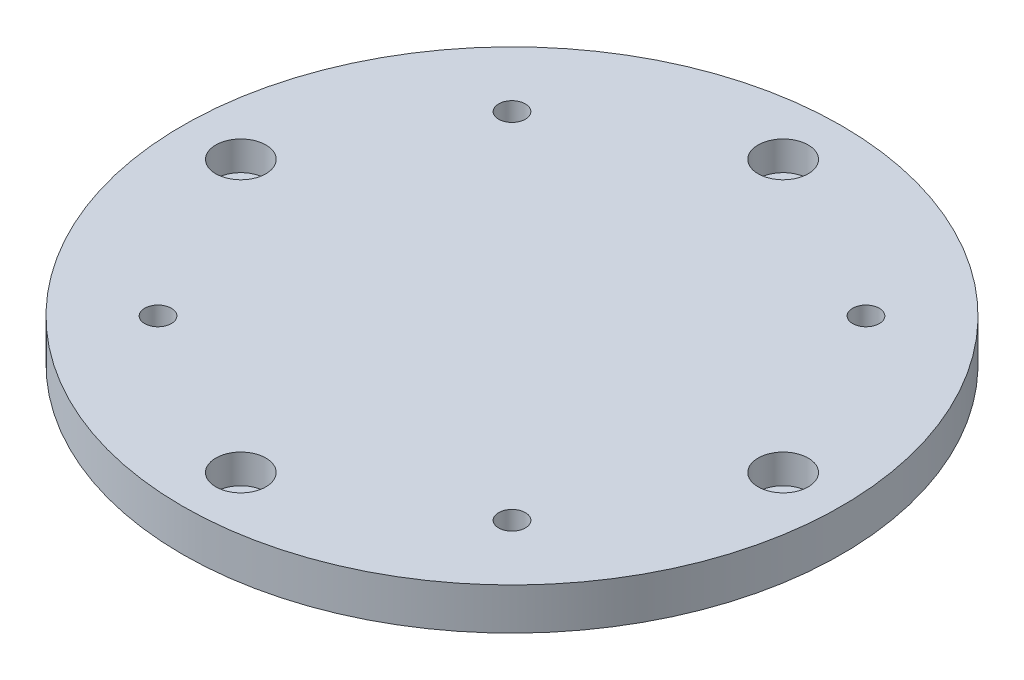
ISO-10303-21;
HEADER;
FILE_DESCRIPTION(('STEP AP214'),'2;1');
FILE_NAME('part.step','',(''),(''),'','','');
FILE_SCHEMA(('AUTOMOTIVE_DESIGN { 1 0 10303 214 1 1 1 1 }'));
ENDSEC;
DATA;
#1=APPLICATION_CONTEXT('core data for automotive mechanical design processes');
#2=APPLICATION_PROTOCOL_DEFINITION('international standard','automotive_design',2000,#1);
#3=PRODUCT_CONTEXT('',#1,'mechanical');
#4=PRODUCT('Part','Part','',(#3));
#5=PRODUCT_RELATED_PRODUCT_CATEGORY('part','',(#4));
#6=PRODUCT_DEFINITION_FORMATION('','',#4);
#7=PRODUCT_DEFINITION_CONTEXT('part definition',#1,'design');
#8=PRODUCT_DEFINITION('design','',#6,#7);
#9=PRODUCT_DEFINITION_SHAPE('','',#8);
#10=(LENGTH_UNIT() NAMED_UNIT(*) SI_UNIT(.MILLI.,.METRE.));
#11=(NAMED_UNIT(*) PLANE_ANGLE_UNIT() SI_UNIT($,.RADIAN.));
#12=(NAMED_UNIT(*) SI_UNIT($,.STERADIAN.) SOLID_ANGLE_UNIT());
#13=UNCERTAINTY_MEASURE_WITH_UNIT(LENGTH_MEASURE(1.E-05),#10,'distance_accuracy_value','');
#14=(GEOMETRIC_REPRESENTATION_CONTEXT(3) GLOBAL_UNCERTAINTY_ASSIGNED_CONTEXT((#13)) GLOBAL_UNIT_ASSIGNED_CONTEXT((#10,
#11,#12)) REPRESENTATION_CONTEXT('',''));
#15=CARTESIAN_POINT('',(0.,0.,0.));
#16=DIRECTION('',(0.,0.,1.));
#17=DIRECTION('',(1.,0.,0.));
#18=AXIS2_PLACEMENT_3D('',#15,#16,#17);
#19=CARTESIAN_POINT('',(-32.5,0.,0.));
#20=DIRECTION('',(0.,1.,0.));
#21=DIRECTION('',(0.,0.,1.));
#22=AXIS2_PLACEMENT_3D('',#19,#20,#21);
#23=CYLINDRICAL_SURFACE('',#22,1.5);
#24=CARTESIAN_POINT('',(-32.5,0.,0.));
#25=DIRECTION('',(0.,1.,0.));
#26=DIRECTION('',(0.,0.,1.));
#27=AXIS2_PLACEMENT_3D('',#24,#25,#26);
#28=CIRCLE('',#27,1.5);
#29=CARTESIAN_POINT('',(-32.5,0.,1.5));
#30=VERTEX_POINT('',#29);
#31=EDGE_CURVE('E59',#30,#30,#28,.T.);
#32=ORIENTED_EDGE('',*,*,#31,.F.);
#33=EDGE_LOOP('',(#32));
#34=FACE_BOUND('',#33,.T.);
#35=CARTESIAN_POINT('',(-32.5,1.5,0.));
#36=DIRECTION('',(0.,1.,0.));
#37=DIRECTION('',(0.,0.,1.));
#38=AXIS2_PLACEMENT_3D('',#35,#36,#37);
#39=CIRCLE('',#38,1.5);
#40=CARTESIAN_POINT('',(-32.5,1.5,1.5));
#41=VERTEX_POINT('',#40);
#42=EDGE_CURVE('E44',#41,#41,#39,.F.);
#43=ORIENTED_EDGE('',*,*,#42,.F.);
#44=EDGE_LOOP('',(#43));
#45=FACE_BOUND('',#44,.T.);
#46=ADVANCED_FACE('F40',(#34,#45),#23,.F.);
#47=CARTESIAN_POINT('',(0.,0.,32.5));
#48=DIRECTION('',(0.,1.,0.));
#49=DIRECTION('',(0.,0.,1.));
#50=AXIS2_PLACEMENT_3D('',#47,#48,#49);
#51=CYLINDRICAL_SURFACE('',#50,1.5);
#52=CARTESIAN_POINT('',(0.,0.,32.5));
#53=DIRECTION('',(0.,1.,0.));
#54=DIRECTION('',(0.,0.,1.));
#55=AXIS2_PLACEMENT_3D('',#52,#53,#54);
#56=CIRCLE('',#55,1.5);
#57=CARTESIAN_POINT('',(0.,0.,34.));
#58=VERTEX_POINT('',#57);
#59=EDGE_CURVE('E83',#58,#58,#56,.T.);
#60=ORIENTED_EDGE('',*,*,#59,.F.);
#61=EDGE_LOOP('',(#60));
#62=FACE_BOUND('',#61,.T.);
#63=CARTESIAN_POINT('',(0.,1.5,32.5));
#64=DIRECTION('',(0.,1.,0.));
#65=DIRECTION('',(0.,0.,1.));
#66=AXIS2_PLACEMENT_3D('',#63,#64,#65);
#67=CIRCLE('',#66,1.5);
#68=CARTESIAN_POINT('',(0.,1.5,34.));
#69=VERTEX_POINT('',#68);
#70=EDGE_CURVE('E70',#69,#69,#67,.F.);
#71=ORIENTED_EDGE('',*,*,#70,.F.);
#72=EDGE_LOOP('',(#71));
#73=FACE_BOUND('',#72,.T.);
#74=ADVANCED_FACE('F195',(#62,#73),#51,.F.);
#75=CARTESIAN_POINT('',(32.5,0.,0.));
#76=DIRECTION('',(0.,1.,0.));
#77=DIRECTION('',(0.,0.,1.));
#78=AXIS2_PLACEMENT_3D('',#75,#76,#77);
#79=CYLINDRICAL_SURFACE('',#78,1.5);
#80=CARTESIAN_POINT('',(32.5,0.,0.));
#81=DIRECTION('',(0.,1.,0.));
#82=DIRECTION('',(0.,0.,1.));
#83=AXIS2_PLACEMENT_3D('',#80,#81,#82);
#84=CIRCLE('',#83,1.5);
#85=CARTESIAN_POINT('',(32.5,0.,1.5));
#86=VERTEX_POINT('',#85);
#87=EDGE_CURVE('E89',#86,#86,#84,.T.);
#88=ORIENTED_EDGE('',*,*,#87,.F.);
#89=EDGE_LOOP('',(#88));
#90=FACE_BOUND('',#89,.T.);
#91=CARTESIAN_POINT('',(32.5,1.5,0.));
#92=DIRECTION('',(0.,1.,0.));
#93=DIRECTION('',(0.,0.,1.));
#94=AXIS2_PLACEMENT_3D('',#91,#92,#93);
#95=CIRCLE('',#94,1.5);
#96=CARTESIAN_POINT('',(32.5,1.5,1.5));
#97=VERTEX_POINT('',#96);
#98=EDGE_CURVE('E66',#97,#97,#95,.F.);
#99=ORIENTED_EDGE('',*,*,#98,.F.);
#100=EDGE_LOOP('',(#99));
#101=FACE_BOUND('',#100,.T.);
#102=ADVANCED_FACE('F191',(#90,#101),#79,.F.);
#103=CARTESIAN_POINT('',(0.,0.,-32.5));
#104=DIRECTION('',(0.,1.,0.));
#105=DIRECTION('',(0.,0.,1.));
#106=AXIS2_PLACEMENT_3D('',#103,#104,#105);
#107=CYLINDRICAL_SURFACE('',#106,1.5);
#108=CARTESIAN_POINT('',(0.,0.,-32.5));
#109=DIRECTION('',(0.,1.,0.));
#110=DIRECTION('',(0.,0.,1.));
#111=AXIS2_PLACEMENT_3D('',#108,#109,#110);
#112=CIRCLE('',#111,1.5);
#113=CARTESIAN_POINT('',(0.,0.,-31.));
#114=VERTEX_POINT('',#113);
#115=EDGE_CURVE('E56',#114,#114,#112,.T.);
#116=ORIENTED_EDGE('',*,*,#115,.F.);
#117=EDGE_LOOP('',(#116));
#118=FACE_BOUND('',#117,.T.);
#119=CARTESIAN_POINT('',(0.,1.5,-32.5));
#120=DIRECTION('',(0.,1.,0.));
#121=DIRECTION('',(0.,0.,1.));
#122=AXIS2_PLACEMENT_3D('',#119,#120,#121);
#123=CIRCLE('',#122,1.5);
#124=CARTESIAN_POINT('',(0.,1.5,-31.));
#125=VERTEX_POINT('',#124);
#126=EDGE_CURVE('E62',#125,#125,#123,.F.);
#127=ORIENTED_EDGE('',*,*,#126,.F.);
#128=EDGE_LOOP('',(#127));
#129=FACE_BOUND('',#128,.T.);
#130=ADVANCED_FACE('F182',(#118,#129),#107,.F.);
#131=CARTESIAN_POINT('',(0.,5.,0.));
#132=DIRECTION('',(0.,-1.,0.));
#133=DIRECTION('',(0.,0.,-1.));
#134=AXIS2_PLACEMENT_3D('',#131,#132,#133);
#135=CYLINDRICAL_SURFACE('',#134,39.5);
#136=CARTESIAN_POINT('',(0.,5.,0.));
#137=DIRECTION('',(0.,1.,0.));
#138=DIRECTION('',(0.,0.,1.));
#139=AXIS2_PLACEMENT_3D('',#136,#137,#138);
#140=CIRCLE('',#139,39.5);
#141=CARTESIAN_POINT('',(0.,5.,39.5));
#142=VERTEX_POINT('',#141);
#143=EDGE_CURVE('E10',#142,#142,#140,.T.);
#144=ORIENTED_EDGE('',*,*,#143,.F.);
#145=EDGE_LOOP('',(#144));
#146=FACE_BOUND('',#145,.T.);
#147=CARTESIAN_POINT('',(0.,0.,0.));
#148=DIRECTION('',(0.,1.,0.));
#149=DIRECTION('',(0.,0.,1.));
#150=AXIS2_PLACEMENT_3D('',#147,#148,#149);
#151=CIRCLE('',#150,39.5);
#152=CARTESIAN_POINT('',(0.,0.,39.5));
#153=VERTEX_POINT('',#152);
#154=EDGE_CURVE('E49',#153,#153,#151,.T.);
#155=ORIENTED_EDGE('',*,*,#154,.T.);
#156=EDGE_LOOP('',(#155));
#157=FACE_BOUND('',#156,.T.);
#158=ADVANCED_FACE('F42',(#146,#157),#135,.T.);
#159=CARTESIAN_POINT('',(0.,5.,0.));
#160=DIRECTION('',(0.,1.,0.));
#161=DIRECTION('',(0.,0.,1.));
#162=AXIS2_PLACEMENT_3D('',#159,#160,#161);
#163=PLANE('',#162);
#164=CARTESIAN_POINT('',(-21.2132034355965,5.,21.2132034355942));
#165=DIRECTION('',(0.,-1.,0.));
#166=DIRECTION('',(0.,0.,-1.));
#167=AXIS2_PLACEMENT_3D('',#164,#165,#166);
#168=CIRCLE('',#167,1.6);
#169=CARTESIAN_POINT('',(-21.2132034355965,5.,19.6132034355942));
#170=VERTEX_POINT('',#169);
#171=EDGE_CURVE('E140',#170,#170,#168,.T.);
#172=ORIENTED_EDGE('',*,*,#171,.T.);
#173=EDGE_LOOP('',(#172));
#174=FACE_BOUND('',#173,.T.);
#175=CARTESIAN_POINT('',(-21.2132034355942,5.,-21.2132034355986));
#176=DIRECTION('',(0.,-1.,0.));
#177=DIRECTION('',(0.,0.,-1.));
#178=AXIS2_PLACEMENT_3D('',#175,#176,#177);
#179=CIRCLE('',#178,1.6);
#180=CARTESIAN_POINT('',(-21.2132034355942,5.,-22.8132034355986));
#181=VERTEX_POINT('',#180);
#182=EDGE_CURVE('E148',#181,#181,#179,.T.);
#183=ORIENTED_EDGE('',*,*,#182,.T.);
#184=EDGE_LOOP('',(#183));
#185=FACE_BOUND('',#184,.T.);
#186=CARTESIAN_POINT('',(21.2132034355986,5.,-21.2132034355964));
#187=DIRECTION('',(0.,-1.,0.));
#188=DIRECTION('',(0.,0.,-1.));
#189=AXIS2_PLACEMENT_3D('',#186,#187,#188);
#190=CIRCLE('',#189,1.6);
#191=CARTESIAN_POINT('',(21.2132034355986,5.,-22.8132034355964));
#192=VERTEX_POINT('',#191);
#193=EDGE_CURVE('E156',#192,#192,#190,.T.);
#194=ORIENTED_EDGE('',*,*,#193,.T.);
#195=EDGE_LOOP('',(#194));
#196=FACE_BOUND('',#195,.T.);
#197=CARTESIAN_POINT('',(21.2132034355964,5.,21.2132034355965));
#198=DIRECTION('',(0.,-1.,0.));
#199=DIRECTION('',(0.,0.,-1.));
#200=AXIS2_PLACEMENT_3D('',#197,#198,#199);
#201=CIRCLE('',#200,1.6);
#202=CARTESIAN_POINT('',(21.2132034355964,5.,19.6132034355965));
#203=VERTEX_POINT('',#202);
#204=EDGE_CURVE('E105',#203,#203,#201,.T.);
#205=ORIENTED_EDGE('',*,*,#204,.T.);
#206=EDGE_LOOP('',(#205));
#207=FACE_BOUND('',#206,.T.);
#208=CARTESIAN_POINT('',(-32.5,5.,0.));
#209=DIRECTION('',(0.,1.,0.));
#210=DIRECTION('',(0.,0.,1.));
#211=AXIS2_PLACEMENT_3D('',#208,#209,#210);
#212=CIRCLE('',#211,3.);
#213=CARTESIAN_POINT('',(-32.5,5.,3.));
#214=VERTEX_POINT('',#213);
#215=EDGE_CURVE('E125',#214,#214,#212,.T.);
#216=ORIENTED_EDGE('',*,*,#215,.F.);
#217=EDGE_LOOP('',(#216));
#218=FACE_BOUND('',#217,.T.);
#219=CARTESIAN_POINT('',(0.,5.,32.5));
#220=DIRECTION('',(0.,1.,0.));
#221=DIRECTION('',(0.,0.,1.));
#222=AXIS2_PLACEMENT_3D('',#219,#220,#221);
#223=CIRCLE('',#222,3.);
#224=CARTESIAN_POINT('',(0.,5.,35.5));
#225=VERTEX_POINT('',#224);
#226=EDGE_CURVE('E121',#225,#225,#223,.T.);
#227=ORIENTED_EDGE('',*,*,#226,.F.);
#228=EDGE_LOOP('',(#227));
#229=FACE_BOUND('',#228,.T.);
#230=CARTESIAN_POINT('',(32.5,5.,0.));
#231=DIRECTION('',(0.,1.,0.));
#232=DIRECTION('',(0.,0.,1.));
#233=AXIS2_PLACEMENT_3D('',#230,#231,#232);
#234=CIRCLE('',#233,3.);
#235=CARTESIAN_POINT('',(32.5,5.,3.));
#236=VERTEX_POINT('',#235);
#237=EDGE_CURVE('E113',#236,#236,#234,.T.);
#238=ORIENTED_EDGE('',*,*,#237,.F.);
#239=EDGE_LOOP('',(#238));
#240=FACE_BOUND('',#239,.T.);
#241=CARTESIAN_POINT('',(0.,5.,-32.5));
#242=DIRECTION('',(0.,1.,0.));
#243=DIRECTION('',(0.,0.,1.));
#244=AXIS2_PLACEMENT_3D('',#241,#242,#243);
#245=CIRCLE('',#244,3.);
#246=CARTESIAN_POINT('',(0.,5.,-29.5));
#247=VERTEX_POINT('',#246);
#248=EDGE_CURVE('E104',#247,#247,#245,.T.);
#249=ORIENTED_EDGE('',*,*,#248,.F.);
#250=EDGE_LOOP('',(#249));
#251=FACE_BOUND('',#250,.T.);
#252=ORIENTED_EDGE('',*,*,#143,.T.);
#253=EDGE_LOOP('',(#252));
#254=FACE_BOUND('',#253,.T.);
#255=ADVANCED_FACE('F171',(#174,#185,#196,#207,#218,#229,#240,#251,#254),#163,.T.);
#256=CARTESIAN_POINT('',(0.,0.,0.));
#257=DIRECTION('',(0.,1.,0.));
#258=DIRECTION('',(0.,0.,1.));
#259=AXIS2_PLACEMENT_3D('',#256,#257,#258);
#260=PLANE('',#259);
#261=CARTESIAN_POINT('',(-21.2132034355965,0.,21.2132034355942));
#262=DIRECTION('',(0.,-1.,0.));
#263=DIRECTION('',(0.,0.,-1.));
#264=AXIS2_PLACEMENT_3D('',#261,#262,#263);
#265=CIRCLE('',#264,1.6);
#266=CARTESIAN_POINT('',(-21.2132034355965,0.,19.6132034355942));
#267=VERTEX_POINT('',#266);
#268=EDGE_CURVE('E144',#267,#267,#265,.T.);
#269=ORIENTED_EDGE('',*,*,#268,.F.);
#270=EDGE_LOOP('',(#269));
#271=FACE_BOUND('',#270,.T.);
#272=CARTESIAN_POINT('',(-21.2132034355942,0.,-21.2132034355986));
#273=DIRECTION('',(0.,-1.,0.));
#274=DIRECTION('',(0.,0.,-1.));
#275=AXIS2_PLACEMENT_3D('',#272,#273,#274);
#276=CIRCLE('',#275,1.6);
#277=CARTESIAN_POINT('',(-21.2132034355942,0.,-22.8132034355986));
#278=VERTEX_POINT('',#277);
#279=EDGE_CURVE('E152',#278,#278,#276,.T.);
#280=ORIENTED_EDGE('',*,*,#279,.F.);
#281=EDGE_LOOP('',(#280));
#282=FACE_BOUND('',#281,.T.);
#283=CARTESIAN_POINT('',(21.2132034355986,0.,-21.2132034355964));
#284=DIRECTION('',(0.,-1.,0.));
#285=DIRECTION('',(0.,0.,-1.));
#286=AXIS2_PLACEMENT_3D('',#283,#284,#285);
#287=CIRCLE('',#286,1.6);
#288=CARTESIAN_POINT('',(21.2132034355986,0.,-22.8132034355964));
#289=VERTEX_POINT('',#288);
#290=EDGE_CURVE('E136',#289,#289,#287,.T.);
#291=ORIENTED_EDGE('',*,*,#290,.F.);
#292=EDGE_LOOP('',(#291));
#293=FACE_BOUND('',#292,.T.);
#294=CARTESIAN_POINT('',(21.2132034355964,0.,21.2132034355965));
#295=DIRECTION('',(0.,-1.,0.));
#296=DIRECTION('',(0.,0.,-1.));
#297=AXIS2_PLACEMENT_3D('',#294,#295,#296);
#298=CIRCLE('',#297,1.6);
#299=CARTESIAN_POINT('',(21.2132034355964,0.,19.6132034355965));
#300=VERTEX_POINT('',#299);
#301=EDGE_CURVE('E132',#300,#300,#298,.T.);
#302=ORIENTED_EDGE('',*,*,#301,.F.);
#303=EDGE_LOOP('',(#302));
#304=FACE_BOUND('',#303,.T.);
#305=ORIENTED_EDGE('',*,*,#115,.T.);
#306=EDGE_LOOP('',(#305));
#307=FACE_BOUND('',#306,.T.);
#308=ORIENTED_EDGE('',*,*,#87,.T.);
#309=EDGE_LOOP('',(#308));
#310=FACE_BOUND('',#309,.T.);
#311=ORIENTED_EDGE('',*,*,#59,.T.);
#312=EDGE_LOOP('',(#311));
#313=FACE_BOUND('',#312,.T.);
#314=ORIENTED_EDGE('',*,*,#31,.T.);
#315=EDGE_LOOP('',(#314));
#316=FACE_BOUND('',#315,.T.);
#317=ORIENTED_EDGE('',*,*,#154,.F.);
#318=EDGE_LOOP('',(#317));
#319=FACE_BOUND('',#318,.T.);
#320=ADVANCED_FACE('F167',(#271,#282,#293,#304,#307,#310,#313,#316,#319),#260,.F.);
#321=CARTESIAN_POINT('',(0.,1.5,-32.5));
#322=DIRECTION('',(0.,1.,0.));
#323=DIRECTION('',(0.,0.,1.));
#324=AXIS2_PLACEMENT_3D('',#321,#322,#323);
#325=PLANE('',#324);
#326=CARTESIAN_POINT('',(0.,1.5,-32.5));
#327=DIRECTION('',(0.,1.,0.));
#328=DIRECTION('',(0.,0.,1.));
#329=AXIS2_PLACEMENT_3D('',#326,#327,#328);
#330=CIRCLE('',#329,3.);
#331=CARTESIAN_POINT('',(0.,1.5,-29.5));
#332=VERTEX_POINT('',#331);
#333=EDGE_CURVE('E100',#332,#332,#330,.T.);
#334=ORIENTED_EDGE('',*,*,#333,.T.);
#335=EDGE_LOOP('',(#334));
#336=FACE_BOUND('',#335,.T.);
#337=ORIENTED_EDGE('',*,*,#126,.T.);
#338=EDGE_LOOP('',(#337));
#339=FACE_BOUND('',#338,.T.);
#340=ADVANCED_FACE('F170',(#336,#339),#325,.T.);
#341=CARTESIAN_POINT('',(0.,1.5,-32.5));
#342=DIRECTION('',(0.,1.,0.));
#343=DIRECTION('',(0.,0.,1.));
#344=AXIS2_PLACEMENT_3D('',#341,#342,#343);
#345=CYLINDRICAL_SURFACE('',#344,3.);
#346=ORIENTED_EDGE('',*,*,#333,.F.);
#347=EDGE_LOOP('',(#346));
#348=FACE_BOUND('',#347,.T.);
#349=ORIENTED_EDGE('',*,*,#248,.T.);
#350=EDGE_LOOP('',(#349));
#351=FACE_BOUND('',#350,.T.);
#352=ADVANCED_FACE('F210',(#348,#351),#345,.F.);
#353=CARTESIAN_POINT('',(32.5,1.5,0.));
#354=DIRECTION('',(0.,1.,0.));
#355=DIRECTION('',(0.,0.,1.));
#356=AXIS2_PLACEMENT_3D('',#353,#354,#355);
#357=PLANE('',#356);
#358=CARTESIAN_POINT('',(32.5,1.5,0.));
#359=DIRECTION('',(0.,1.,0.));
#360=DIRECTION('',(0.,0.,1.));
#361=AXIS2_PLACEMENT_3D('',#358,#359,#360);
#362=CIRCLE('',#361,3.);
#363=CARTESIAN_POINT('',(32.5,1.5,3.));
#364=VERTEX_POINT('',#363);
#365=EDGE_CURVE('E109',#364,#364,#362,.T.);
#366=ORIENTED_EDGE('',*,*,#365,.T.);
#367=EDGE_LOOP('',(#366));
#368=FACE_BOUND('',#367,.T.);
#369=ORIENTED_EDGE('',*,*,#98,.T.);
#370=EDGE_LOOP('',(#369));
#371=FACE_BOUND('',#370,.T.);
#372=ADVANCED_FACE('F214',(#368,#371),#357,.T.);
#373=CARTESIAN_POINT('',(32.5,1.5,0.));
#374=DIRECTION('',(0.,1.,0.));
#375=DIRECTION('',(0.,0.,1.));
#376=AXIS2_PLACEMENT_3D('',#373,#374,#375);
#377=CYLINDRICAL_SURFACE('',#376,3.);
#378=ORIENTED_EDGE('',*,*,#365,.F.);
#379=EDGE_LOOP('',(#378));
#380=FACE_BOUND('',#379,.T.);
#381=ORIENTED_EDGE('',*,*,#237,.T.);
#382=EDGE_LOOP('',(#381));
#383=FACE_BOUND('',#382,.T.);
#384=ADVANCED_FACE('F218',(#380,#383),#377,.F.);
#385=CARTESIAN_POINT('',(0.,1.5,32.5));
#386=DIRECTION('',(0.,1.,0.));
#387=DIRECTION('',(0.,0.,1.));
#388=AXIS2_PLACEMENT_3D('',#385,#386,#387);
#389=PLANE('',#388);
#390=CARTESIAN_POINT('',(0.,1.5,32.5));
#391=DIRECTION('',(0.,1.,0.));
#392=DIRECTION('',(0.,0.,1.));
#393=AXIS2_PLACEMENT_3D('',#390,#391,#392);
#394=CIRCLE('',#393,3.);
#395=CARTESIAN_POINT('',(0.,1.5,35.5));
#396=VERTEX_POINT('',#395);
#397=EDGE_CURVE('E117',#396,#396,#394,.T.);
#398=ORIENTED_EDGE('',*,*,#397,.T.);
#399=EDGE_LOOP('',(#398));
#400=FACE_BOUND('',#399,.T.);
#401=ORIENTED_EDGE('',*,*,#70,.T.);
#402=EDGE_LOOP('',(#401));
#403=FACE_BOUND('',#402,.T.);
#404=ADVANCED_FACE('F222',(#400,#403),#389,.T.);
#405=CARTESIAN_POINT('',(0.,1.5,32.5));
#406=DIRECTION('',(0.,1.,0.));
#407=DIRECTION('',(0.,0.,1.));
#408=AXIS2_PLACEMENT_3D('',#405,#406,#407);
#409=CYLINDRICAL_SURFACE('',#408,3.);
#410=ORIENTED_EDGE('',*,*,#397,.F.);
#411=EDGE_LOOP('',(#410));
#412=FACE_BOUND('',#411,.T.);
#413=ORIENTED_EDGE('',*,*,#226,.T.);
#414=EDGE_LOOP('',(#413));
#415=FACE_BOUND('',#414,.T.);
#416=ADVANCED_FACE('F226',(#412,#415),#409,.F.);
#417=CARTESIAN_POINT('',(-32.5,1.5,0.));
#418=DIRECTION('',(0.,1.,0.));
#419=DIRECTION('',(0.,0.,1.));
#420=AXIS2_PLACEMENT_3D('',#417,#418,#419);
#421=PLANE('',#420);
#422=CARTESIAN_POINT('',(-32.5,1.5,0.));
#423=DIRECTION('',(0.,1.,0.));
#424=DIRECTION('',(0.,0.,1.));
#425=AXIS2_PLACEMENT_3D('',#422,#423,#424);
#426=CIRCLE('',#425,3.);
#427=CARTESIAN_POINT('',(-32.5,1.5,3.));
#428=VERTEX_POINT('',#427);
#429=EDGE_CURVE('E67',#428,#428,#426,.T.);
#430=ORIENTED_EDGE('',*,*,#429,.T.);
#431=EDGE_LOOP('',(#430));
#432=FACE_BOUND('',#431,.T.);
#433=ORIENTED_EDGE('',*,*,#42,.T.);
#434=EDGE_LOOP('',(#433));
#435=FACE_BOUND('',#434,.T.);
#436=ADVANCED_FACE('F230',(#432,#435),#421,.T.);
#437=CARTESIAN_POINT('',(-32.5,1.5,0.));
#438=DIRECTION('',(0.,1.,0.));
#439=DIRECTION('',(0.,0.,1.));
#440=AXIS2_PLACEMENT_3D('',#437,#438,#439);
#441=CYLINDRICAL_SURFACE('',#440,3.);
#442=ORIENTED_EDGE('',*,*,#429,.F.);
#443=EDGE_LOOP('',(#442));
#444=FACE_BOUND('',#443,.T.);
#445=ORIENTED_EDGE('',*,*,#215,.T.);
#446=EDGE_LOOP('',(#445));
#447=FACE_BOUND('',#446,.T.);
#448=ADVANCED_FACE('F232',(#444,#447),#441,.F.);
#449=CARTESIAN_POINT('',(21.2132034355964,5.,21.2132034355965));
#450=DIRECTION('',(0.,-1.,0.));
#451=DIRECTION('',(0.,0.,-1.));
#452=AXIS2_PLACEMENT_3D('',#449,#450,#451);
#453=CYLINDRICAL_SURFACE('',#452,1.6);
#454=ORIENTED_EDGE('',*,*,#204,.F.);
#455=EDGE_LOOP('',(#454));
#456=FACE_BOUND('',#455,.T.);
#457=ORIENTED_EDGE('',*,*,#301,.T.);
#458=EDGE_LOOP('',(#457));
#459=FACE_BOUND('',#458,.T.);
#460=ADVANCED_FACE('F235',(#456,#459),#453,.F.);
#461=CARTESIAN_POINT('',(21.2132034355986,5.,-21.2132034355964));
#462=DIRECTION('',(0.,-1.,0.));
#463=DIRECTION('',(0.,0.,-1.));
#464=AXIS2_PLACEMENT_3D('',#461,#462,#463);
#465=CYLINDRICAL_SURFACE('',#464,1.6);
#466=ORIENTED_EDGE('',*,*,#193,.F.);
#467=EDGE_LOOP('',(#466));
#468=FACE_BOUND('',#467,.T.);
#469=ORIENTED_EDGE('',*,*,#290,.T.);
#470=EDGE_LOOP('',(#469));
#471=FACE_BOUND('',#470,.T.);
#472=ADVANCED_FACE('F165',(#468,#471),#465,.F.);
#473=CARTESIAN_POINT('',(-21.2132034355942,5.,-21.2132034355986));
#474=DIRECTION('',(0.,-1.,0.));
#475=DIRECTION('',(0.,0.,-1.));
#476=AXIS2_PLACEMENT_3D('',#473,#474,#475);
#477=CYLINDRICAL_SURFACE('',#476,1.6);
#478=ORIENTED_EDGE('',*,*,#182,.F.);
#479=EDGE_LOOP('',(#478));
#480=FACE_BOUND('',#479,.T.);
#481=ORIENTED_EDGE('',*,*,#279,.T.);
#482=EDGE_LOOP('',(#481));
#483=FACE_BOUND('',#482,.T.);
#484=ADVANCED_FACE('F246',(#480,#483),#477,.F.);
#485=CARTESIAN_POINT('',(-21.2132034355965,5.,21.2132034355942));
#486=DIRECTION('',(0.,-1.,0.));
#487=DIRECTION('',(0.,0.,-1.));
#488=AXIS2_PLACEMENT_3D('',#485,#486,#487);
#489=CYLINDRICAL_SURFACE('',#488,1.6);
#490=ORIENTED_EDGE('',*,*,#171,.F.);
#491=EDGE_LOOP('',(#490));
#492=FACE_BOUND('',#491,.T.);
#493=ORIENTED_EDGE('',*,*,#268,.T.);
#494=EDGE_LOOP('',(#493));
#495=FACE_BOUND('',#494,.T.);
#496=ADVANCED_FACE('F243',(#492,#495),#489,.F.);
#497=CLOSED_SHELL('',(#46,#74,#102,#130,#158,#255,#320,#340,#352,#372,#384,#404,#416,#436,#448,
#460,#472,#484,#496));
#498=MANIFOLD_SOLID_BREP('B2',#497);
#499=ADVANCED_BREP_SHAPE_REPRESENTATION('',(#18,#498),#14);
#500=SHAPE_DEFINITION_REPRESENTATION(#9,#499);
ENDSEC;
END-ISO-10303-21;
